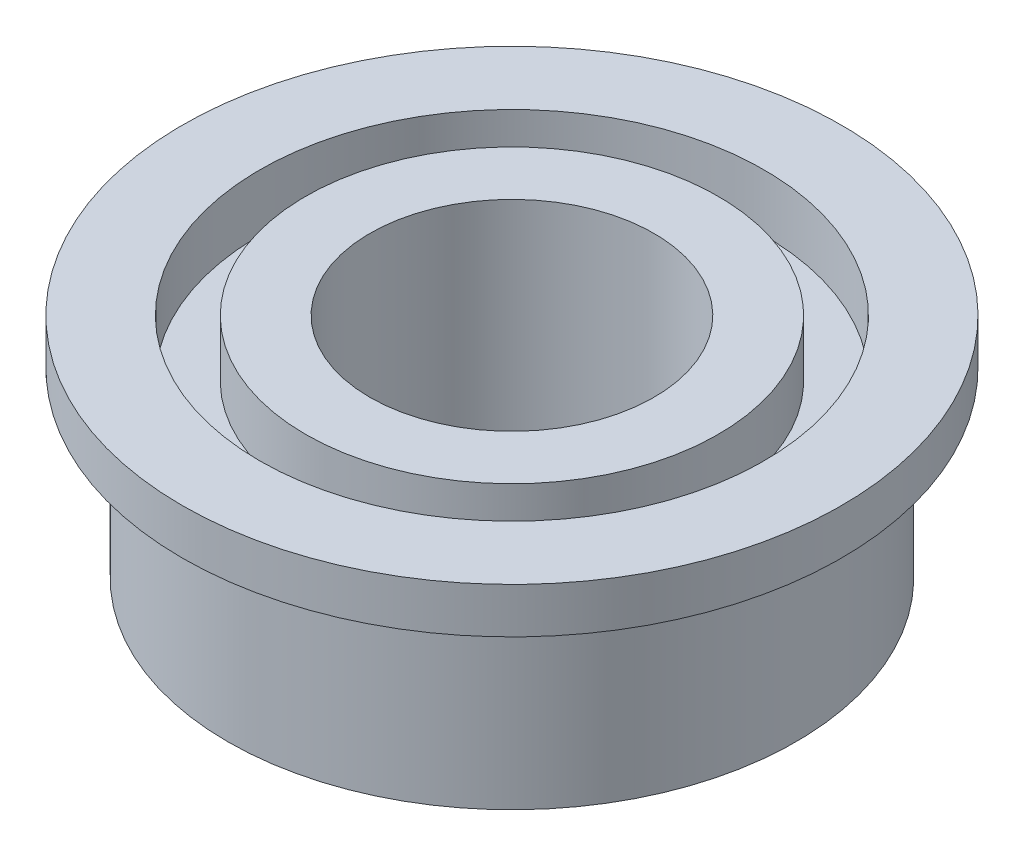
ISO-10303-21;
HEADER;
FILE_DESCRIPTION(('STEP AP214'),'2;1');
FILE_NAME('part.step','',(''),(''),'','','');
FILE_SCHEMA(('AUTOMOTIVE_DESIGN { 1 0 10303 214 1 1 1 1 }'));
ENDSEC;
DATA;
#1=APPLICATION_CONTEXT('core data for automotive mechanical design processes');
#2=APPLICATION_PROTOCOL_DEFINITION('international standard','automotive_design',2000,#1);
#3=PRODUCT_CONTEXT('',#1,'mechanical');
#4=PRODUCT('Part','Part','',(#3));
#5=PRODUCT_RELATED_PRODUCT_CATEGORY('part','',(#4));
#6=PRODUCT_DEFINITION_FORMATION('','',#4);
#7=PRODUCT_DEFINITION_CONTEXT('part definition',#1,'design');
#8=PRODUCT_DEFINITION('design','',#6,#7);
#9=PRODUCT_DEFINITION_SHAPE('','',#8);
#10=(LENGTH_UNIT() NAMED_UNIT(*) SI_UNIT(.MILLI.,.METRE.));
#11=(NAMED_UNIT(*) PLANE_ANGLE_UNIT() SI_UNIT($,.RADIAN.));
#12=(NAMED_UNIT(*) SI_UNIT($,.STERADIAN.) SOLID_ANGLE_UNIT());
#13=UNCERTAINTY_MEASURE_WITH_UNIT(LENGTH_MEASURE(1.E-05),#10,'distance_accuracy_value','');
#14=(GEOMETRIC_REPRESENTATION_CONTEXT(3) GLOBAL_UNCERTAINTY_ASSIGNED_CONTEXT((#13)) GLOBAL_UNIT_ASSIGNED_CONTEXT((#10,
#11,#12)) REPRESENTATION_CONTEXT('',''));
#15=CARTESIAN_POINT('',(0.,0.,0.));
#16=DIRECTION('',(0.,0.,1.));
#17=DIRECTION('',(1.,0.,0.));
#18=AXIS2_PLACEMENT_3D('',#15,#16,#17);
#19=CARTESIAN_POINT('',(0.,4.,0.));
#20=DIRECTION('',(0.,1.,0.));
#21=DIRECTION('',(0.,0.,1.));
#22=AXIS2_PLACEMENT_3D('',#19,#20,#21);
#23=PLANE('',#22);
#24=CARTESIAN_POINT('',(0.,4.,0.));
#25=DIRECTION('',(0.,1.,0.));
#26=DIRECTION('',(0.,0.,1.));
#27=AXIS2_PLACEMENT_3D('',#24,#25,#26);
#28=CIRCLE('',#27,2.5);
#29=CARTESIAN_POINT('',(0.,4.,2.5));
#30=VERTEX_POINT('',#29);
#31=EDGE_CURVE('E51',#30,#30,#28,.T.);
#32=ORIENTED_EDGE('',*,*,#31,.F.);
#33=EDGE_LOOP('',(#32));
#34=FACE_BOUND('',#33,.T.);
#35=CARTESIAN_POINT('',(0.,4.,0.));
#36=DIRECTION('',(0.,1.,0.));
#37=DIRECTION('',(0.,0.,1.));
#38=AXIS2_PLACEMENT_3D('',#35,#36,#37);
#39=CIRCLE('',#38,3.62986082266486);
#40=CARTESIAN_POINT('',(0.,4.,3.62986082266486));
#41=VERTEX_POINT('',#40);
#42=EDGE_CURVE('E75',#41,#41,#39,.T.);
#43=ORIENTED_EDGE('',*,*,#42,.T.);
#44=EDGE_LOOP('',(#43));
#45=FACE_BOUND('',#44,.T.);
#46=ADVANCED_FACE('F32',(#34,#45),#23,.T.);
#47=CARTESIAN_POINT('',(0.,0.,0.));
#48=DIRECTION('',(0.,1.,0.));
#49=DIRECTION('',(0.,0.,1.));
#50=AXIS2_PLACEMENT_3D('',#47,#48,#49);
#51=PLANE('',#50);
#52=CARTESIAN_POINT('',(0.,0.,0.));
#53=DIRECTION('',(0.,1.,0.));
#54=DIRECTION('',(0.,0.,1.));
#55=AXIS2_PLACEMENT_3D('',#52,#53,#54);
#56=CIRCLE('',#55,2.5);
#57=CARTESIAN_POINT('',(0.,0.,2.5));
#58=VERTEX_POINT('',#57);
#59=EDGE_CURVE('E43',#58,#58,#56,.T.);
#60=ORIENTED_EDGE('',*,*,#59,.T.);
#61=EDGE_LOOP('',(#60));
#62=FACE_BOUND('',#61,.T.);
#63=CARTESIAN_POINT('',(0.,0.,0.));
#64=DIRECTION('',(0.,-1.,0.));
#65=DIRECTION('',(0.,0.,-1.));
#66=AXIS2_PLACEMENT_3D('',#63,#64,#65);
#67=CIRCLE('',#66,3.69211472738202);
#68=CARTESIAN_POINT('',(0.,0.,-3.69211472738202));
#69=VERTEX_POINT('',#68);
#70=EDGE_CURVE('E63',#69,#69,#67,.T.);
#71=ORIENTED_EDGE('',*,*,#70,.T.);
#72=EDGE_LOOP('',(#71));
#73=FACE_BOUND('',#72,.T.);
#74=ADVANCED_FACE('F120',(#62,#73),#51,.F.);
#75=CARTESIAN_POINT('',(0.,0.,0.));
#76=DIRECTION('',(0.,-1.,0.));
#77=DIRECTION('',(0.,0.,-1.));
#78=AXIS2_PLACEMENT_3D('',#75,#76,#77);
#79=CIRCLE('',#78,4.35508581994814);
#80=CARTESIAN_POINT('',(0.,0.,-4.35508581994814));
#81=VERTEX_POINT('',#80);
#82=EDGE_CURVE('E57',#81,#81,#79,.T.);
#83=ORIENTED_EDGE('',*,*,#82,.F.);
#84=EDGE_LOOP('',(#83));
#85=FACE_BOUND('',#84,.T.);
#86=CARTESIAN_POINT('',(0.,0.,0.));
#87=DIRECTION('',(0.,1.,0.));
#88=DIRECTION('',(0.,0.,1.));
#89=AXIS2_PLACEMENT_3D('',#86,#87,#88);
#90=CIRCLE('',#89,5.);
#91=CARTESIAN_POINT('',(0.,0.,5.));
#92=VERTEX_POINT('',#91);
#93=EDGE_CURVE('E36',#92,#92,#90,.T.);
#94=ORIENTED_EDGE('',*,*,#93,.F.);
#95=EDGE_LOOP('',(#94));
#96=FACE_BOUND('',#95,.T.);
#97=ADVANCED_FACE('F125',(#85,#96),#51,.F.);
#98=CARTESIAN_POINT('',(0.,3.2,0.));
#99=DIRECTION('',(0.,-1.,0.));
#100=DIRECTION('',(0.,0.,-1.));
#101=AXIS2_PLACEMENT_3D('',#98,#99,#100);
#102=CYLINDRICAL_SURFACE('',#101,5.);
#103=CARTESIAN_POINT('',(0.,3.2,0.));
#104=DIRECTION('',(0.,1.,0.));
#105=DIRECTION('',(0.,0.,1.));
#106=AXIS2_PLACEMENT_3D('',#103,#104,#105);
#107=CIRCLE('',#106,5.);
#108=CARTESIAN_POINT('',(0.,3.2,5.));
#109=VERTEX_POINT('',#108);
#110=EDGE_CURVE('E10',#109,#109,#107,.T.);
#111=ORIENTED_EDGE('',*,*,#110,.F.);
#112=EDGE_LOOP('',(#111));
#113=FACE_BOUND('',#112,.T.);
#114=ORIENTED_EDGE('',*,*,#93,.T.);
#115=EDGE_LOOP('',(#114));
#116=FACE_BOUND('',#115,.T.);
#117=ADVANCED_FACE('F34',(#113,#116),#102,.T.);
#118=CARTESIAN_POINT('',(0.,3.2,0.));
#119=DIRECTION('',(0.,-1.,0.));
#120=DIRECTION('',(0.,0.,-1.));
#121=AXIS2_PLACEMENT_3D('',#118,#119,#120);
#122=CYLINDRICAL_SURFACE('',#121,2.5);
#123=ORIENTED_EDGE('',*,*,#59,.F.);
#124=EDGE_LOOP('',(#123));
#125=FACE_BOUND('',#124,.T.);
#126=ORIENTED_EDGE('',*,*,#31,.T.);
#127=EDGE_LOOP('',(#126));
#128=FACE_BOUND('',#127,.T.);
#129=ADVANCED_FACE('F112',(#125,#128),#122,.F.);
#130=CARTESIAN_POINT('',(0.,3.2,0.));
#131=DIRECTION('',(0.,1.,0.));
#132=DIRECTION('',(0.,0.,1.));
#133=AXIS2_PLACEMENT_3D('',#130,#131,#132);
#134=PLANE('',#133);
#135=CARTESIAN_POINT('',(0.,3.2,0.));
#136=DIRECTION('',(0.,1.,0.));
#137=DIRECTION('',(0.,0.,1.));
#138=AXIS2_PLACEMENT_3D('',#135,#136,#137);
#139=CIRCLE('',#138,5.8);
#140=CARTESIAN_POINT('',(0.,3.2,5.8));
#141=VERTEX_POINT('',#140);
#142=EDGE_CURVE('E48',#141,#141,#139,.T.);
#143=ORIENTED_EDGE('',*,*,#142,.F.);
#144=EDGE_LOOP('',(#143));
#145=FACE_BOUND('',#144,.T.);
#146=ORIENTED_EDGE('',*,*,#110,.T.);
#147=EDGE_LOOP('',(#146));
#148=FACE_BOUND('',#147,.T.);
#149=ADVANCED_FACE('F101',(#145,#148),#134,.F.);
#150=CARTESIAN_POINT('',(0.,4.,0.));
#151=DIRECTION('',(0.,1.,0.));
#152=DIRECTION('',(0.,0.,1.));
#153=AXIS2_PLACEMENT_3D('',#150,#151,#152);
#154=CIRCLE('',#153,4.43730614042602);
#155=CARTESIAN_POINT('',(0.,4.,4.43730614042602));
#156=VERTEX_POINT('',#155);
#157=EDGE_CURVE('E69',#156,#156,#154,.T.);
#158=ORIENTED_EDGE('',*,*,#157,.F.);
#159=EDGE_LOOP('',(#158));
#160=FACE_BOUND('',#159,.T.);
#161=CARTESIAN_POINT('',(0.,4.,0.));
#162=DIRECTION('',(0.,1.,0.));
#163=DIRECTION('',(0.,0.,1.));
#164=AXIS2_PLACEMENT_3D('',#161,#162,#163);
#165=CIRCLE('',#164,5.8);
#166=CARTESIAN_POINT('',(0.,4.,5.8));
#167=VERTEX_POINT('',#166);
#168=EDGE_CURVE('E47',#167,#167,#165,.T.);
#169=ORIENTED_EDGE('',*,*,#168,.T.);
#170=EDGE_LOOP('',(#169));
#171=FACE_BOUND('',#170,.T.);
#172=ADVANCED_FACE('F97',(#160,#171),#23,.T.);
#173=CARTESIAN_POINT('',(0.,4.,0.));
#174=DIRECTION('',(0.,-1.,0.));
#175=DIRECTION('',(0.,0.,-1.));
#176=AXIS2_PLACEMENT_3D('',#173,#174,#175);
#177=CYLINDRICAL_SURFACE('',#176,5.8);
#178=ORIENTED_EDGE('',*,*,#168,.F.);
#179=EDGE_LOOP('',(#178));
#180=FACE_BOUND('',#179,.T.);
#181=ORIENTED_EDGE('',*,*,#142,.T.);
#182=EDGE_LOOP('',(#181));
#183=FACE_BOUND('',#182,.T.);
#184=ADVANCED_FACE('F100',(#180,#183),#177,.T.);
#185=CARTESIAN_POINT('',(0.,1.,0.));
#186=DIRECTION('',(0.,-1.,0.));
#187=DIRECTION('',(0.,0.,-1.));
#188=AXIS2_PLACEMENT_3D('',#185,#186,#187);
#189=CYLINDRICAL_SURFACE('',#188,4.35508581994814);
#190=CARTESIAN_POINT('',(0.,1.,0.));
#191=DIRECTION('',(0.,-1.,0.));
#192=DIRECTION('',(0.,0.,-1.));
#193=AXIS2_PLACEMENT_3D('',#190,#191,#192);
#194=CIRCLE('',#193,4.35508581994814);
#195=CARTESIAN_POINT('',(0.,1.,-4.35508581994814));
#196=VERTEX_POINT('',#195);
#197=EDGE_CURVE('E56',#196,#196,#194,.T.);
#198=ORIENTED_EDGE('',*,*,#197,.F.);
#199=EDGE_LOOP('',(#198));
#200=FACE_BOUND('',#199,.T.);
#201=ORIENTED_EDGE('',*,*,#82,.T.);
#202=EDGE_LOOP('',(#201));
#203=FACE_BOUND('',#202,.T.);
#204=ADVANCED_FACE('F107',(#200,#203),#189,.F.);
#205=CARTESIAN_POINT('',(0.,1.,0.));
#206=DIRECTION('',(0.,-1.,0.));
#207=DIRECTION('',(0.,0.,-1.));
#208=AXIS2_PLACEMENT_3D('',#205,#206,#207);
#209=PLANE('',#208);
#210=CARTESIAN_POINT('',(0.,1.,0.));
#211=DIRECTION('',(0.,-1.,0.));
#212=DIRECTION('',(0.,0.,-1.));
#213=AXIS2_PLACEMENT_3D('',#210,#211,#212);
#214=CIRCLE('',#213,3.69211472738202);
#215=CARTESIAN_POINT('',(0.,1.,-3.69211472738202));
#216=VERTEX_POINT('',#215);
#217=EDGE_CURVE('E60',#216,#216,#214,.T.);
#218=ORIENTED_EDGE('',*,*,#217,.F.);
#219=EDGE_LOOP('',(#218));
#220=FACE_BOUND('',#219,.T.);
#221=ORIENTED_EDGE('',*,*,#197,.T.);
#222=EDGE_LOOP('',(#221));
#223=FACE_BOUND('',#222,.T.);
#224=ADVANCED_FACE('F132',(#220,#223),#209,.T.);
#225=CARTESIAN_POINT('',(0.,1.,0.));
#226=DIRECTION('',(0.,-1.,0.));
#227=DIRECTION('',(0.,0.,-1.));
#228=AXIS2_PLACEMENT_3D('',#225,#226,#227);
#229=CYLINDRICAL_SURFACE('',#228,3.69211472738202);
#230=ORIENTED_EDGE('',*,*,#217,.T.);
#231=EDGE_LOOP('',(#230));
#232=FACE_BOUND('',#231,.T.);
#233=ORIENTED_EDGE('',*,*,#70,.F.);
#234=EDGE_LOOP('',(#233));
#235=FACE_BOUND('',#234,.T.);
#236=ADVANCED_FACE('F93',(#232,#235),#229,.T.);
#237=CARTESIAN_POINT('',(0.,3.,0.));
#238=DIRECTION('',(0.,1.,0.));
#239=DIRECTION('',(0.,0.,1.));
#240=AXIS2_PLACEMENT_3D('',#237,#238,#239);
#241=CYLINDRICAL_SURFACE('',#240,4.43730614042602);
#242=CARTESIAN_POINT('',(0.,3.,0.));
#243=DIRECTION('',(0.,1.,0.));
#244=DIRECTION('',(0.,0.,1.));
#245=AXIS2_PLACEMENT_3D('',#242,#243,#244);
#246=CIRCLE('',#245,4.43730614042602);
#247=CARTESIAN_POINT('',(0.,3.,4.43730614042602));
#248=VERTEX_POINT('',#247);
#249=EDGE_CURVE('E66',#248,#248,#246,.T.);
#250=ORIENTED_EDGE('',*,*,#249,.F.);
#251=EDGE_LOOP('',(#250));
#252=FACE_BOUND('',#251,.T.);
#253=ORIENTED_EDGE('',*,*,#157,.T.);
#254=EDGE_LOOP('',(#253));
#255=FACE_BOUND('',#254,.T.);
#256=ADVANCED_FACE('F87',(#252,#255),#241,.F.);
#257=CARTESIAN_POINT('',(0.,3.,0.));
#258=DIRECTION('',(0.,1.,0.));
#259=DIRECTION('',(0.,0.,1.));
#260=AXIS2_PLACEMENT_3D('',#257,#258,#259);
#261=PLANE('',#260);
#262=CARTESIAN_POINT('',(0.,3.,0.));
#263=DIRECTION('',(0.,1.,0.));
#264=DIRECTION('',(0.,0.,1.));
#265=AXIS2_PLACEMENT_3D('',#262,#263,#264);
#266=CIRCLE('',#265,3.62986082266486);
#267=CARTESIAN_POINT('',(0.,3.,3.62986082266486));
#268=VERTEX_POINT('',#267);
#269=EDGE_CURVE('E72',#268,#268,#266,.T.);
#270=ORIENTED_EDGE('',*,*,#269,.F.);
#271=EDGE_LOOP('',(#270));
#272=FACE_BOUND('',#271,.T.);
#273=ORIENTED_EDGE('',*,*,#249,.T.);
#274=EDGE_LOOP('',(#273));
#275=FACE_BOUND('',#274,.T.);
#276=ADVANCED_FACE('F84',(#272,#275),#261,.T.);
#277=CARTESIAN_POINT('',(0.,3.,0.));
#278=DIRECTION('',(0.,1.,0.));
#279=DIRECTION('',(0.,0.,1.));
#280=AXIS2_PLACEMENT_3D('',#277,#278,#279);
#281=CYLINDRICAL_SURFACE('',#280,3.62986082266486);
#282=ORIENTED_EDGE('',*,*,#269,.T.);
#283=EDGE_LOOP('',(#282));
#284=FACE_BOUND('',#283,.T.);
#285=ORIENTED_EDGE('',*,*,#42,.F.);
#286=EDGE_LOOP('',(#285));
#287=FACE_BOUND('',#286,.T.);
#288=ADVANCED_FACE('F81',(#284,#287),#281,.T.);
#289=CLOSED_SHELL('',(#46,#74,#97,#117,#129,#149,#172,#184,#204,#224,#236,#256,#276,#288));
#290=MANIFOLD_SOLID_BREP('B2',#289);
#291=ADVANCED_BREP_SHAPE_REPRESENTATION('',(#18,#290),#14);
#292=SHAPE_DEFINITION_REPRESENTATION(#9,#291);
ENDSEC;
END-ISO-10303-21;
